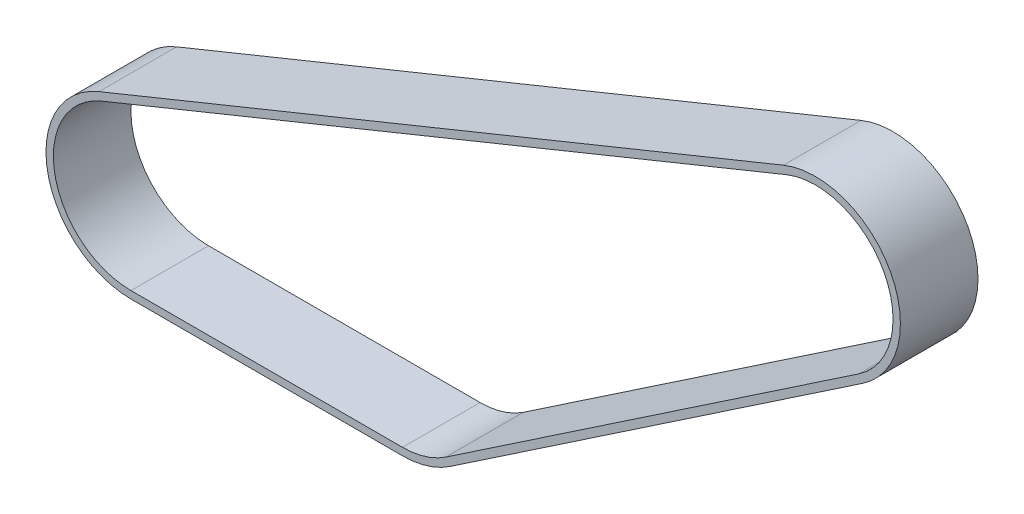
ISO-10303-21;
HEADER;
FILE_DESCRIPTION(('STEP AP214'),'2;1');
FILE_NAME('part.step','',(''),(''),'','','');
FILE_SCHEMA(('AUTOMOTIVE_DESIGN { 1 0 10303 214 1 1 1 1 }'));
ENDSEC;
DATA;
#1=APPLICATION_CONTEXT('core data for automotive mechanical design processes');
#2=APPLICATION_PROTOCOL_DEFINITION('international standard','automotive_design',2000,#1);
#3=PRODUCT_CONTEXT('',#1,'mechanical');
#4=PRODUCT('Part','Part','',(#3));
#5=PRODUCT_RELATED_PRODUCT_CATEGORY('part','',(#4));
#6=PRODUCT_DEFINITION_FORMATION('','',#4);
#7=PRODUCT_DEFINITION_CONTEXT('part definition',#1,'design');
#8=PRODUCT_DEFINITION('design','',#6,#7);
#9=PRODUCT_DEFINITION_SHAPE('','',#8);
#10=(LENGTH_UNIT() NAMED_UNIT(*) SI_UNIT(.MILLI.,.METRE.));
#11=(NAMED_UNIT(*) PLANE_ANGLE_UNIT() SI_UNIT($,.RADIAN.));
#12=(NAMED_UNIT(*) SI_UNIT($,.STERADIAN.) SOLID_ANGLE_UNIT());
#13=UNCERTAINTY_MEASURE_WITH_UNIT(LENGTH_MEASURE(1.E-05),#10,'distance_accuracy_value','');
#14=(GEOMETRIC_REPRESENTATION_CONTEXT(3) GLOBAL_UNCERTAINTY_ASSIGNED_CONTEXT((#13)) GLOBAL_UNIT_ASSIGNED_CONTEXT((#10,
#11,#12)) REPRESENTATION_CONTEXT('',''));
#15=CARTESIAN_POINT('',(0.,0.,0.));
#16=DIRECTION('',(0.,0.,1.));
#17=DIRECTION('',(1.,0.,0.));
#18=AXIS2_PLACEMENT_3D('',#15,#16,#17);
#19=CARTESIAN_POINT('',(-220.560530395085,-89.7504610070541,50.));
#20=DIRECTION('',(0.,0.,1.));
#21=DIRECTION('',(1.,0.,0.));
#22=AXIS2_PLACEMENT_3D('',#19,#20,#21);
#23=PLANE('',#22);
#24=CARTESIAN_POINT('',(-220.560530395085,-89.7504610070541,50.));
#25=DIRECTION('',(0.,0.,1.));
#26=DIRECTION('',(1.,0.,0.));
#27=AXIS2_PLACEMENT_3D('',#24,#25,#26);
#28=CIRCLE('',#27,54.752);
#29=CARTESIAN_POINT('',(-241.197082178949,-39.0364172472445,50.));
#30=VERTEX_POINT('',#29);
#31=CARTESIAN_POINT('',(-220.560530395085,-144.502461007054,50.));
#32=VERTEX_POINT('',#31);
#33=EDGE_CURVE('E174',#30,#32,#28,.T.);
#34=ORIENTED_EDGE('',*,*,#33,.T.);
#35=DIRECTION('',(1.,0.,0.));
#36=VECTOR('',#35,1.);
#37=CARTESIAN_POINT('',(-220.560530395085,-144.502461007054,50.));
#38=LINE('',#37,#36);
#39=CARTESIAN_POINT('',(-45.5605303950848,-144.502461007054,50.));
#40=VERTEX_POINT('',#39);
#41=EDGE_CURVE('E177',#32,#40,#38,.T.);
#42=ORIENTED_EDGE('',*,*,#41,.T.);
#43=CARTESIAN_POINT('',(-45.5605303950848,-89.7504610070541,50.));
#44=DIRECTION('',(0.,0.,1.));
#45=DIRECTION('',(1.,0.,0.));
#46=AXIS2_PLACEMENT_3D('',#43,#44,#45);
#47=CIRCLE('',#46,54.752);
#48=CARTESIAN_POINT('',(-14.9436005442547,-135.141926179588,50.));
#49=VERTEX_POINT('',#48);
#50=EDGE_CURVE('E180',#40,#49,#47,.T.);
#51=ORIENTED_EDGE('',*,*,#50,.T.);
#52=DIRECTION('',(0.829037572555045,0.559192903470742,0.));
#53=VECTOR('',#52,1.);
#54=CARTESIAN_POINT('',(-14.9436005442547,-135.141926179588,50.));
#55=LINE('',#54,#53);
#56=CARTESIAN_POINT('',(251.177460245915,44.3589958345202,50.));
#57=VERTEX_POINT('',#56);
#58=EDGE_CURVE('E182',#49,#57,#55,.T.);
#59=ORIENTED_EDGE('',*,*,#58,.T.);
#60=CARTESIAN_POINT('',(220.560530395085,89.750461007054,50.));
#61=DIRECTION('',(0.,0.,1.));
#62=DIRECTION('',(1.,0.,0.));
#63=AXIS2_PLACEMENT_3D('',#60,#61,#62);
#64=CIRCLE('',#63,54.752);
#65=CARTESIAN_POINT('',(199.92397861122,140.464504766864,50.));
#66=VERTEX_POINT('',#65);
#67=EDGE_CURVE('E184',#57,#66,#64,.T.);
#68=ORIENTED_EDGE('',*,*,#67,.T.);
#69=DIRECTION('',(-0.926250068669811,-0.376909551867779,0.));
#70=VECTOR('',#69,1.);
#71=CARTESIAN_POINT('',(-241.197082178949,-39.0364172472445,50.));
#72=LINE('',#71,#70);
#73=EDGE_CURVE('E186',#66,#30,#72,.T.);
#74=ORIENTED_EDGE('',*,*,#73,.T.);
#75=EDGE_LOOP('',(#34,#42,#51,#59,#68,#74));
#76=FACE_BOUND('',#75,.T.);
#77=DIRECTION('',(1.,0.,0.));
#78=VECTOR('',#77,1.);
#79=CARTESIAN_POINT('',(-220.560530395085,-139.750461007054,50.));
#80=LINE('',#79,#78);
#81=CARTESIAN_POINT('',(-220.560530395085,-139.750461007054,50.));
#82=VERTEX_POINT('',#81);
#83=CARTESIAN_POINT('',(-45.5605303950848,-139.750461007054,50.));
#84=VERTEX_POINT('',#83);
#85=EDGE_CURVE('E131',#82,#84,#80,.T.);
#86=ORIENTED_EDGE('',*,*,#85,.F.);
#87=CARTESIAN_POINT('',(-220.560530395085,-89.7504610070541,50.));
#88=DIRECTION('',(0.,0.,1.));
#89=DIRECTION('',(1.,0.,0.));
#90=AXIS2_PLACEMENT_3D('',#87,#88,#89);
#91=CIRCLE('',#90,50.);
#92=CARTESIAN_POINT('',(-239.406007988474,-43.4379575735635,50.));
#93=VERTEX_POINT('',#92);
#94=EDGE_CURVE('E123',#93,#82,#91,.T.);
#95=ORIENTED_EDGE('',*,*,#94,.F.);
#96=DIRECTION('',(-0.926250068669811,-0.376909551867779,0.));
#97=VECTOR('',#96,1.);
#98=CARTESIAN_POINT('',(-239.406007988474,-43.4379575735635,50.));
#99=LINE('',#98,#97);
#100=CARTESIAN_POINT('',(201.715052801696,136.062964440545,50.));
#101=VERTEX_POINT('',#100);
#102=EDGE_CURVE('E152',#101,#93,#99,.T.);
#103=ORIENTED_EDGE('',*,*,#102,.F.);
#104=CARTESIAN_POINT('',(220.560530395085,89.750461007054,50.));
#105=DIRECTION('',(0.,0.,1.));
#106=DIRECTION('',(1.,0.,0.));
#107=AXIS2_PLACEMENT_3D('',#104,#105,#106);
#108=CIRCLE('',#107,50.);
#109=CARTESIAN_POINT('',(248.520175568622,48.2985823793018,50.));
#110=VERTEX_POINT('',#109);
#111=EDGE_CURVE('E150',#110,#101,#108,.T.);
#112=ORIENTED_EDGE('',*,*,#111,.F.);
#113=DIRECTION('',(0.829037572555045,0.559192903470742,0.));
#114=VECTOR('',#113,1.);
#115=CARTESIAN_POINT('',(-17.6008852215477,-131.202339634806,50.));
#116=LINE('',#115,#114);
#117=CARTESIAN_POINT('',(-17.6008852215477,-131.202339634806,50.));
#118=VERTEX_POINT('',#117);
#119=EDGE_CURVE('E146',#118,#110,#116,.T.);
#120=ORIENTED_EDGE('',*,*,#119,.F.);
#121=CARTESIAN_POINT('',(-45.5605303950848,-89.7504610070541,50.));
#122=DIRECTION('',(0.,0.,1.));
#123=DIRECTION('',(1.,0.,0.));
#124=AXIS2_PLACEMENT_3D('',#121,#122,#123);
#125=CIRCLE('',#124,50.);
#126=EDGE_CURVE('E144',#84,#118,#125,.T.);
#127=ORIENTED_EDGE('',*,*,#126,.F.);
#128=EDGE_LOOP('',(#86,#95,#103,#112,#120,#127));
#129=FACE_BOUND('',#128,.T.);
#130=ADVANCED_FACE('F34',(#76,#129),#23,.T.);
#131=CARTESIAN_POINT('',(-220.560530395085,-89.7504610070541,0.));
#132=DIRECTION('',(0.,0.,1.));
#133=DIRECTION('',(1.,0.,0.));
#134=AXIS2_PLACEMENT_3D('',#131,#132,#133);
#135=PLANE('',#134);
#136=CARTESIAN_POINT('',(-220.560530395085,-89.7504610070541,0.));
#137=DIRECTION('',(0.,0.,1.));
#138=DIRECTION('',(1.,0.,0.));
#139=AXIS2_PLACEMENT_3D('',#136,#137,#138);
#140=CIRCLE('',#139,54.752);
#141=CARTESIAN_POINT('',(-241.197082178949,-39.0364172472445,0.));
#142=VERTEX_POINT('',#141);
#143=CARTESIAN_POINT('',(-220.560530395085,-144.502461007054,0.));
#144=VERTEX_POINT('',#143);
#145=EDGE_CURVE('E139',#142,#144,#140,.T.);
#146=ORIENTED_EDGE('',*,*,#145,.F.);
#147=DIRECTION('',(-0.926250068669811,-0.376909551867779,0.));
#148=VECTOR('',#147,1.);
#149=CARTESIAN_POINT('',(-241.197082178949,-39.0364172472445,0.));
#150=LINE('',#149,#148);
#151=CARTESIAN_POINT('',(199.92397861122,140.464504766864,0.));
#152=VERTEX_POINT('',#151);
#153=EDGE_CURVE('E178',#152,#142,#150,.T.);
#154=ORIENTED_EDGE('',*,*,#153,.F.);
#155=CARTESIAN_POINT('',(220.560530395085,89.750461007054,0.));
#156=DIRECTION('',(0.,0.,1.));
#157=DIRECTION('',(1.,0.,0.));
#158=AXIS2_PLACEMENT_3D('',#155,#156,#157);
#159=CIRCLE('',#158,54.752);
#160=CARTESIAN_POINT('',(251.177460245915,44.3589958345202,0.));
#161=VERTEX_POINT('',#160);
#162=EDGE_CURVE('E197',#161,#152,#159,.T.);
#163=ORIENTED_EDGE('',*,*,#162,.F.);
#164=DIRECTION('',(0.829037572555045,0.559192903470742,0.));
#165=VECTOR('',#164,1.);
#166=CARTESIAN_POINT('',(-14.9436005442547,-135.141926179588,0.));
#167=LINE('',#166,#165);
#168=CARTESIAN_POINT('',(-14.9436005442547,-135.141926179588,0.));
#169=VERTEX_POINT('',#168);
#170=EDGE_CURVE('E195',#169,#161,#167,.T.);
#171=ORIENTED_EDGE('',*,*,#170,.F.);
#172=CARTESIAN_POINT('',(-45.5605303950848,-89.7504610070541,0.));
#173=DIRECTION('',(0.,0.,1.));
#174=DIRECTION('',(1.,0.,0.));
#175=AXIS2_PLACEMENT_3D('',#172,#173,#174);
#176=CIRCLE('',#175,54.752);
#177=CARTESIAN_POINT('',(-45.5605303950848,-144.502461007054,0.));
#178=VERTEX_POINT('',#177);
#179=EDGE_CURVE('E193',#178,#169,#176,.T.);
#180=ORIENTED_EDGE('',*,*,#179,.F.);
#181=DIRECTION('',(1.,0.,0.));
#182=VECTOR('',#181,1.);
#183=CARTESIAN_POINT('',(-220.560530395085,-144.502461007054,0.));
#184=LINE('',#183,#182);
#185=EDGE_CURVE('E191',#144,#178,#184,.T.);
#186=ORIENTED_EDGE('',*,*,#185,.F.);
#187=EDGE_LOOP('',(#146,#154,#163,#171,#180,#186));
#188=FACE_BOUND('',#187,.T.);
#189=CARTESIAN_POINT('',(-220.560530395085,-89.7504610070541,0.));
#190=DIRECTION('',(0.,0.,1.));
#191=DIRECTION('',(1.,0.,0.));
#192=AXIS2_PLACEMENT_3D('',#189,#190,#191);
#193=CIRCLE('',#192,50.);
#194=CARTESIAN_POINT('',(-239.406007988474,-43.4379575735635,0.));
#195=VERTEX_POINT('',#194);
#196=CARTESIAN_POINT('',(-220.560530395085,-139.750461007054,0.));
#197=VERTEX_POINT('',#196);
#198=EDGE_CURVE('E57',#195,#197,#193,.T.);
#199=ORIENTED_EDGE('',*,*,#198,.T.);
#200=DIRECTION('',(1.,0.,0.));
#201=VECTOR('',#200,1.);
#202=CARTESIAN_POINT('',(-220.560530395085,-139.750461007054,0.));
#203=LINE('',#202,#201);
#204=CARTESIAN_POINT('',(-45.5605303950848,-139.750461007054,0.));
#205=VERTEX_POINT('',#204);
#206=EDGE_CURVE('E138',#197,#205,#203,.T.);
#207=ORIENTED_EDGE('',*,*,#206,.T.);
#208=CARTESIAN_POINT('',(-45.5605303950848,-89.7504610070541,0.));
#209=DIRECTION('',(0.,0.,1.));
#210=DIRECTION('',(1.,0.,0.));
#211=AXIS2_PLACEMENT_3D('',#208,#209,#210);
#212=CIRCLE('',#211,50.);
#213=CARTESIAN_POINT('',(-17.6008852215477,-131.202339634806,0.));
#214=VERTEX_POINT('',#213);
#215=EDGE_CURVE('E156',#205,#214,#212,.T.);
#216=ORIENTED_EDGE('',*,*,#215,.T.);
#217=DIRECTION('',(0.829037572555045,0.559192903470742,0.));
#218=VECTOR('',#217,1.);
#219=CARTESIAN_POINT('',(-17.6008852215477,-131.202339634806,0.));
#220=LINE('',#219,#218);
#221=CARTESIAN_POINT('',(248.520175568622,48.2985823793018,0.));
#222=VERTEX_POINT('',#221);
#223=EDGE_CURVE('E159',#214,#222,#220,.T.);
#224=ORIENTED_EDGE('',*,*,#223,.T.);
#225=CARTESIAN_POINT('',(220.560530395085,89.750461007054,0.));
#226=DIRECTION('',(0.,0.,1.));
#227=DIRECTION('',(1.,0.,0.));
#228=AXIS2_PLACEMENT_3D('',#225,#226,#227);
#229=CIRCLE('',#228,50.);
#230=CARTESIAN_POINT('',(201.715052801696,136.062964440545,0.));
#231=VERTEX_POINT('',#230);
#232=EDGE_CURVE('E162',#222,#231,#229,.T.);
#233=ORIENTED_EDGE('',*,*,#232,.T.);
#234=DIRECTION('',(-0.926250068669811,-0.376909551867779,0.));
#235=VECTOR('',#234,1.);
#236=CARTESIAN_POINT('',(-239.406007988474,-43.4379575735635,0.));
#237=LINE('',#236,#235);
#238=EDGE_CURVE('E132',#231,#195,#237,.T.);
#239=ORIENTED_EDGE('',*,*,#238,.T.);
#240=EDGE_LOOP('',(#199,#207,#216,#224,#233,#239));
#241=FACE_BOUND('',#240,.T.);
#242=ADVANCED_FACE('F221',(#188,#241),#135,.F.);
#243=CARTESIAN_POINT('',(-220.560530395085,-89.7504610070541,50.));
#244=DIRECTION('',(0.,0.,-1.));
#245=DIRECTION('',(-1.,0.,0.));
#246=AXIS2_PLACEMENT_3D('',#243,#244,#245);
#247=CYLINDRICAL_SURFACE('',#246,54.752);
#248=ORIENTED_EDGE('',*,*,#145,.T.);
#249=DIRECTION('',(0.,0.,-1.));
#250=VECTOR('',#249,1.);
#251=CARTESIAN_POINT('',(-220.560530395085,-144.502461007054,50.));
#252=LINE('',#251,#250);
#253=EDGE_CURVE('E11',#32,#144,#252,.T.);
#254=ORIENTED_EDGE('',*,*,#253,.F.);
#255=ORIENTED_EDGE('',*,*,#33,.F.);
#256=DIRECTION('',(0.,0.,-1.));
#257=VECTOR('',#256,1.);
#258=CARTESIAN_POINT('',(-241.197082178949,-39.0364172472445,50.));
#259=LINE('',#258,#257);
#260=EDGE_CURVE('E188',#30,#142,#259,.T.);
#261=ORIENTED_EDGE('',*,*,#260,.T.);
#262=EDGE_LOOP('',(#248,#254,#255,#261));
#263=FACE_BOUND('',#262,.T.);
#264=ADVANCED_FACE('F36',(#263),#247,.T.);
#265=CARTESIAN_POINT('',(-220.560530395085,-144.502461007054,50.));
#266=DIRECTION('',(0.,1.,0.));
#267=DIRECTION('',(0.,0.,1.));
#268=AXIS2_PLACEMENT_3D('',#265,#266,#267);
#269=PLANE('',#268);
#270=ORIENTED_EDGE('',*,*,#185,.T.);
#271=DIRECTION('',(0.,0.,-1.));
#272=VECTOR('',#271,1.);
#273=CARTESIAN_POINT('',(-45.5605303950848,-144.502461007054,50.));
#274=LINE('',#273,#272);
#275=EDGE_CURVE('E42',#40,#178,#274,.T.);
#276=ORIENTED_EDGE('',*,*,#275,.F.);
#277=ORIENTED_EDGE('',*,*,#41,.F.);
#278=ORIENTED_EDGE('',*,*,#253,.T.);
#279=EDGE_LOOP('',(#270,#276,#277,#278));
#280=FACE_BOUND('',#279,.T.);
#281=ADVANCED_FACE('F238',(#280),#269,.F.);
#282=CARTESIAN_POINT('',(-45.5605303950848,-89.7504610070541,50.));
#283=DIRECTION('',(0.,0.,-1.));
#284=DIRECTION('',(-1.,0.,0.));
#285=AXIS2_PLACEMENT_3D('',#282,#283,#284);
#286=CYLINDRICAL_SURFACE('',#285,54.752);
#287=ORIENTED_EDGE('',*,*,#179,.T.);
#288=DIRECTION('',(0.,0.,-1.));
#289=VECTOR('',#288,1.);
#290=CARTESIAN_POINT('',(-14.9436005442547,-135.141926179588,50.));
#291=LINE('',#290,#289);
#292=EDGE_CURVE('E208',#49,#169,#291,.T.);
#293=ORIENTED_EDGE('',*,*,#292,.F.);
#294=ORIENTED_EDGE('',*,*,#50,.F.);
#295=ORIENTED_EDGE('',*,*,#275,.T.);
#296=EDGE_LOOP('',(#287,#293,#294,#295));
#297=FACE_BOUND('',#296,.T.);
#298=ADVANCED_FACE('F215',(#297),#286,.T.);
#299=CARTESIAN_POINT('',(-14.9436005442547,-135.141926179588,50.));
#300=DIRECTION('',(-0.559192903470742,0.829037572555045,0.));
#301=DIRECTION('',(-0.829037572555045,-0.559192903470742,0.));
#302=AXIS2_PLACEMENT_3D('',#299,#300,#301);
#303=PLANE('',#302);
#304=ORIENTED_EDGE('',*,*,#170,.T.);
#305=DIRECTION('',(0.,0.,-1.));
#306=VECTOR('',#305,1.);
#307=CARTESIAN_POINT('',(251.177460245915,44.3589958345202,50.));
#308=LINE('',#307,#306);
#309=EDGE_CURVE('E205',#57,#161,#308,.T.);
#310=ORIENTED_EDGE('',*,*,#309,.F.);
#311=ORIENTED_EDGE('',*,*,#58,.F.);
#312=ORIENTED_EDGE('',*,*,#292,.T.);
#313=EDGE_LOOP('',(#304,#310,#311,#312));
#314=FACE_BOUND('',#313,.T.);
#315=ADVANCED_FACE('F227',(#314),#303,.F.);
#316=CARTESIAN_POINT('',(220.560530395085,89.750461007054,50.));
#317=DIRECTION('',(0.,0.,-1.));
#318=DIRECTION('',(-1.,0.,0.));
#319=AXIS2_PLACEMENT_3D('',#316,#317,#318);
#320=CYLINDRICAL_SURFACE('',#319,54.752);
#321=ORIENTED_EDGE('',*,*,#162,.T.);
#322=DIRECTION('',(0.,0.,-1.));
#323=VECTOR('',#322,1.);
#324=CARTESIAN_POINT('',(199.92397861122,140.464504766864,50.));
#325=LINE('',#324,#323);
#326=EDGE_CURVE('E202',#66,#152,#325,.T.);
#327=ORIENTED_EDGE('',*,*,#326,.F.);
#328=ORIENTED_EDGE('',*,*,#67,.F.);
#329=ORIENTED_EDGE('',*,*,#309,.T.);
#330=EDGE_LOOP('',(#321,#327,#328,#329));
#331=FACE_BOUND('',#330,.T.);
#332=ADVANCED_FACE('F231',(#331),#320,.T.);
#333=CARTESIAN_POINT('',(-241.197082178949,-39.0364172472445,50.));
#334=DIRECTION('',(0.376909551867779,-0.926250068669811,0.));
#335=DIRECTION('',(0.926250068669811,0.376909551867779,0.));
#336=AXIS2_PLACEMENT_3D('',#333,#334,#335);
#337=PLANE('',#336);
#338=ORIENTED_EDGE('',*,*,#153,.T.);
#339=ORIENTED_EDGE('',*,*,#260,.F.);
#340=ORIENTED_EDGE('',*,*,#73,.F.);
#341=ORIENTED_EDGE('',*,*,#326,.T.);
#342=EDGE_LOOP('',(#338,#339,#340,#341));
#343=FACE_BOUND('',#342,.T.);
#344=ADVANCED_FACE('F241',(#343),#337,.F.);
#345=CARTESIAN_POINT('',(-220.560530395085,-89.7504610070541,50.));
#346=DIRECTION('',(0.,0.,-1.));
#347=DIRECTION('',(-1.,0.,0.));
#348=AXIS2_PLACEMENT_3D('',#345,#346,#347);
#349=CYLINDRICAL_SURFACE('',#348,50.);
#350=ORIENTED_EDGE('',*,*,#198,.F.);
#351=DIRECTION('',(0.,0.,-1.));
#352=VECTOR('',#351,1.);
#353=CARTESIAN_POINT('',(-239.406007988474,-43.4379575735635,50.));
#354=LINE('',#353,#352);
#355=EDGE_CURVE('E127',#93,#195,#354,.T.);
#356=ORIENTED_EDGE('',*,*,#355,.F.);
#357=ORIENTED_EDGE('',*,*,#94,.T.);
#358=DIRECTION('',(0.,0.,-1.));
#359=VECTOR('',#358,1.);
#360=CARTESIAN_POINT('',(-220.560530395085,-139.750461007054,50.));
#361=LINE('',#360,#359);
#362=EDGE_CURVE('E126',#82,#197,#361,.T.);
#363=ORIENTED_EDGE('',*,*,#362,.T.);
#364=EDGE_LOOP('',(#350,#356,#357,#363));
#365=FACE_BOUND('',#364,.T.);
#366=ADVANCED_FACE('F125',(#365),#349,.F.);
#367=CARTESIAN_POINT('',(-220.560530395085,-139.750461007054,50.));
#368=DIRECTION('',(0.,1.,0.));
#369=DIRECTION('',(0.,0.,1.));
#370=AXIS2_PLACEMENT_3D('',#367,#368,#369);
#371=PLANE('',#370);
#372=ORIENTED_EDGE('',*,*,#206,.F.);
#373=ORIENTED_EDGE('',*,*,#362,.F.);
#374=ORIENTED_EDGE('',*,*,#85,.T.);
#375=DIRECTION('',(0.,0.,-1.));
#376=VECTOR('',#375,1.);
#377=CARTESIAN_POINT('',(-45.5605303950848,-139.750461007054,50.));
#378=LINE('',#377,#376);
#379=EDGE_CURVE('E140',#84,#205,#378,.T.);
#380=ORIENTED_EDGE('',*,*,#379,.T.);
#381=EDGE_LOOP('',(#372,#373,#374,#380));
#382=FACE_BOUND('',#381,.T.);
#383=ADVANCED_FACE('F135',(#382),#371,.T.);
#384=CARTESIAN_POINT('',(-45.5605303950848,-89.7504610070541,50.));
#385=DIRECTION('',(0.,0.,-1.));
#386=DIRECTION('',(-1.,0.,0.));
#387=AXIS2_PLACEMENT_3D('',#384,#385,#386);
#388=CYLINDRICAL_SURFACE('',#387,50.);
#389=ORIENTED_EDGE('',*,*,#215,.F.);
#390=ORIENTED_EDGE('',*,*,#379,.F.);
#391=ORIENTED_EDGE('',*,*,#126,.T.);
#392=DIRECTION('',(0.,0.,-1.));
#393=VECTOR('',#392,1.);
#394=CARTESIAN_POINT('',(-17.6008852215477,-131.202339634806,50.));
#395=LINE('',#394,#393);
#396=EDGE_CURVE('E171',#118,#214,#395,.T.);
#397=ORIENTED_EDGE('',*,*,#396,.T.);
#398=EDGE_LOOP('',(#389,#390,#391,#397));
#399=FACE_BOUND('',#398,.T.);
#400=ADVANCED_FACE('F259',(#399),#388,.F.);
#401=CARTESIAN_POINT('',(-17.6008852215477,-131.202339634806,50.));
#402=DIRECTION('',(-0.559192903470742,0.829037572555045,0.));
#403=DIRECTION('',(-0.829037572555045,-0.559192903470742,0.));
#404=AXIS2_PLACEMENT_3D('',#401,#402,#403);
#405=PLANE('',#404);
#406=ORIENTED_EDGE('',*,*,#223,.F.);
#407=ORIENTED_EDGE('',*,*,#396,.F.);
#408=ORIENTED_EDGE('',*,*,#119,.T.);
#409=DIRECTION('',(0.,0.,-1.));
#410=VECTOR('',#409,1.);
#411=CARTESIAN_POINT('',(248.520175568622,48.2985823793018,50.));
#412=LINE('',#411,#410);
#413=EDGE_CURVE('E169',#110,#222,#412,.T.);
#414=ORIENTED_EDGE('',*,*,#413,.T.);
#415=EDGE_LOOP('',(#406,#407,#408,#414));
#416=FACE_BOUND('',#415,.T.);
#417=ADVANCED_FACE('F262',(#416),#405,.T.);
#418=CARTESIAN_POINT('',(220.560530395085,89.750461007054,50.));
#419=DIRECTION('',(0.,0.,-1.));
#420=DIRECTION('',(-1.,0.,0.));
#421=AXIS2_PLACEMENT_3D('',#418,#419,#420);
#422=CYLINDRICAL_SURFACE('',#421,50.);
#423=ORIENTED_EDGE('',*,*,#232,.F.);
#424=ORIENTED_EDGE('',*,*,#413,.F.);
#425=ORIENTED_EDGE('',*,*,#111,.T.);
#426=DIRECTION('',(0.,0.,-1.));
#427=VECTOR('',#426,1.);
#428=CARTESIAN_POINT('',(201.715052801696,136.062964440545,50.));
#429=LINE('',#428,#427);
#430=EDGE_CURVE('E49',#101,#231,#429,.T.);
#431=ORIENTED_EDGE('',*,*,#430,.T.);
#432=EDGE_LOOP('',(#423,#424,#425,#431));
#433=FACE_BOUND('',#432,.T.);
#434=ADVANCED_FACE('F266',(#433),#422,.F.);
#435=CARTESIAN_POINT('',(-239.406007988474,-43.4379575735635,50.));
#436=DIRECTION('',(0.376909551867779,-0.926250068669811,0.));
#437=DIRECTION('',(0.926250068669811,0.376909551867779,0.));
#438=AXIS2_PLACEMENT_3D('',#435,#436,#437);
#439=PLANE('',#438);
#440=ORIENTED_EDGE('',*,*,#238,.F.);
#441=ORIENTED_EDGE('',*,*,#430,.F.);
#442=ORIENTED_EDGE('',*,*,#102,.T.);
#443=ORIENTED_EDGE('',*,*,#355,.T.);
#444=EDGE_LOOP('',(#440,#441,#442,#443));
#445=FACE_BOUND('',#444,.T.);
#446=ADVANCED_FACE('F270',(#445),#439,.T.);
#447=CLOSED_SHELL('',(#130,#242,#264,#281,#298,#315,#332,#344,#366,#383,#400,#417,#434,#446));
#448=MANIFOLD_SOLID_BREP('B2',#447);
#449=ADVANCED_BREP_SHAPE_REPRESENTATION('',(#18,#448),#14);
#450=SHAPE_DEFINITION_REPRESENTATION(#9,#449);
ENDSEC;
END-ISO-10303-21;
